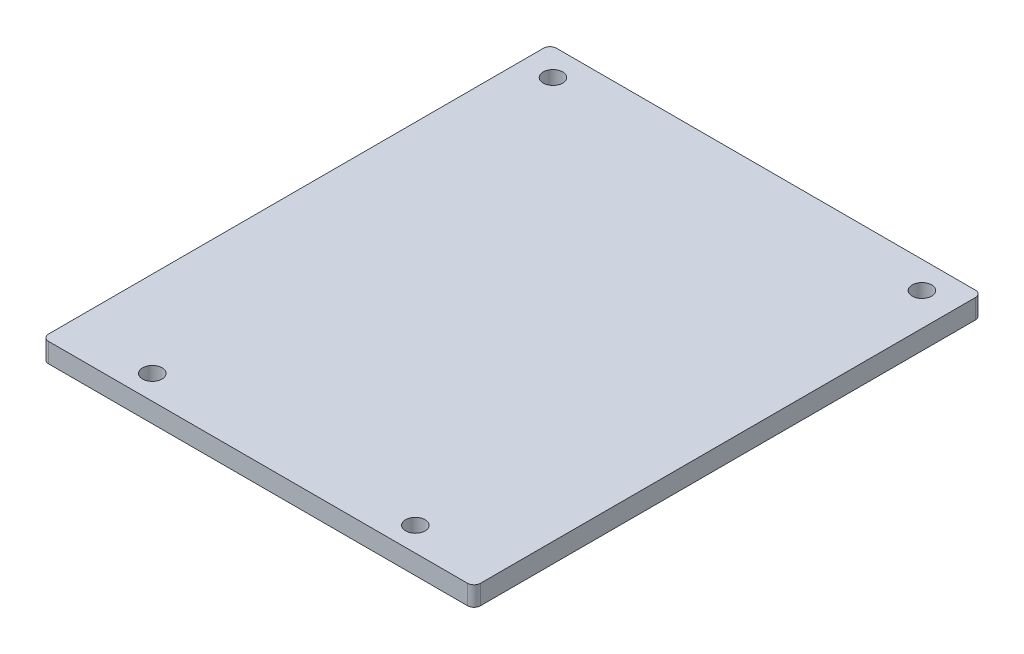
ISO-10303-21;
HEADER;
FILE_DESCRIPTION(('STEP AP214'),'2;1');
FILE_NAME('part.step','',(''),(''),'','','');
FILE_SCHEMA(('AUTOMOTIVE_DESIGN { 1 0 10303 214 1 1 1 1 }'));
ENDSEC;
DATA;
#1=APPLICATION_CONTEXT('core data for automotive mechanical design processes');
#2=APPLICATION_PROTOCOL_DEFINITION('international standard','automotive_design',2000,#1);
#3=PRODUCT_CONTEXT('',#1,'mechanical');
#4=PRODUCT('Part','Part','',(#3));
#5=PRODUCT_RELATED_PRODUCT_CATEGORY('part','',(#4));
#6=PRODUCT_DEFINITION_FORMATION('','',#4);
#7=PRODUCT_DEFINITION_CONTEXT('part definition',#1,'design');
#8=PRODUCT_DEFINITION('design','',#6,#7);
#9=PRODUCT_DEFINITION_SHAPE('','',#8);
#10=(LENGTH_UNIT() NAMED_UNIT(*) SI_UNIT(.MILLI.,.METRE.));
#11=(NAMED_UNIT(*) PLANE_ANGLE_UNIT() SI_UNIT($,.RADIAN.));
#12=(NAMED_UNIT(*) SI_UNIT($,.STERADIAN.) SOLID_ANGLE_UNIT());
#13=UNCERTAINTY_MEASURE_WITH_UNIT(LENGTH_MEASURE(1.E-05),#10,'distance_accuracy_value','');
#14=(GEOMETRIC_REPRESENTATION_CONTEXT(3) GLOBAL_UNCERTAINTY_ASSIGNED_CONTEXT((#13)) GLOBAL_UNIT_ASSIGNED_CONTEXT((#10,
#11,#12)) REPRESENTATION_CONTEXT('',''));
#15=CARTESIAN_POINT('',(0.,0.,0.));
#16=DIRECTION('',(0.,0.,1.));
#17=DIRECTION('',(1.,0.,0.));
#18=AXIS2_PLACEMENT_3D('',#15,#16,#17);
#19=CARTESIAN_POINT('',(0.,3.,0.));
#20=DIRECTION('',(1.,0.,0.));
#21=DIRECTION('',(0.,0.,-1.));
#22=AXIS2_PLACEMENT_3D('',#19,#20,#21);
#23=PLANE('',#22);
#24=DIRECTION('',(0.,0.,1.));
#25=VECTOR('',#24,1.);
#26=CARTESIAN_POINT('',(0.,0.,0.));
#27=LINE('',#26,#25);
#28=CARTESIAN_POINT('',(0.,0.,-77.105));
#29=VERTEX_POINT('',#28);
#30=CARTESIAN_POINT('',(0.,0.,-1.));
#31=VERTEX_POINT('',#30);
#32=EDGE_CURVE('E136',#29,#31,#27,.T.);
#33=ORIENTED_EDGE('',*,*,#32,.T.);
#34=DIRECTION('',(0.,-1.,0.));
#35=VECTOR('',#34,1.);
#36=CARTESIAN_POINT('',(0.,3.,-1.));
#37=LINE('',#36,#35);
#38=CARTESIAN_POINT('',(0.,3.,-1.));
#39=VERTEX_POINT('',#38);
#40=EDGE_CURVE('E111',#31,#39,#37,.F.);
#41=ORIENTED_EDGE('',*,*,#40,.T.);
#42=DIRECTION('',(0.,0.,1.));
#43=VECTOR('',#42,1.);
#44=CARTESIAN_POINT('',(0.,3.,0.));
#45=LINE('',#44,#43);
#46=CARTESIAN_POINT('',(0.,3.,-77.105));
#47=VERTEX_POINT('',#46);
#48=EDGE_CURVE('E149',#47,#39,#45,.T.);
#49=ORIENTED_EDGE('',*,*,#48,.F.);
#50=DIRECTION('',(0.,-1.,0.));
#51=VECTOR('',#50,1.);
#52=CARTESIAN_POINT('',(0.,3.,-77.105));
#53=LINE('',#52,#51);
#54=EDGE_CURVE('E117',#47,#29,#53,.T.);
#55=ORIENTED_EDGE('',*,*,#54,.T.);
#56=EDGE_LOOP('',(#33,#41,#49,#55));
#57=FACE_BOUND('',#56,.T.);
#58=ADVANCED_FACE('F39',(#57),#23,.F.);
#59=CARTESIAN_POINT('',(0.,3.,0.));
#60=DIRECTION('',(0.,0.,-1.));
#61=DIRECTION('',(-1.,0.,0.));
#62=AXIS2_PLACEMENT_3D('',#59,#60,#61);
#63=PLANE('',#62);
#64=DIRECTION('',(1.,0.,0.));
#65=VECTOR('',#64,1.);
#66=CARTESIAN_POINT('',(0.,3.,0.));
#67=LINE('',#66,#65);
#68=CARTESIAN_POINT('',(1.,3.,0.));
#69=VERTEX_POINT('',#68);
#70=CARTESIAN_POINT('',(65.421,3.,0.));
#71=VERTEX_POINT('',#70);
#72=EDGE_CURVE('E127',#69,#71,#67,.T.);
#73=ORIENTED_EDGE('',*,*,#72,.F.);
#74=DIRECTION('',(0.,-1.,0.));
#75=VECTOR('',#74,1.);
#76=CARTESIAN_POINT('',(1.,3.,0.));
#77=LINE('',#76,#75);
#78=CARTESIAN_POINT('',(1.,0.,0.));
#79=VERTEX_POINT('',#78);
#80=EDGE_CURVE('E110',#69,#79,#77,.T.);
#81=ORIENTED_EDGE('',*,*,#80,.T.);
#82=DIRECTION('',(1.,0.,0.));
#83=VECTOR('',#82,1.);
#84=CARTESIAN_POINT('',(0.,0.,0.));
#85=LINE('',#84,#83);
#86=CARTESIAN_POINT('',(65.421,0.,0.));
#87=VERTEX_POINT('',#86);
#88=EDGE_CURVE('E124',#79,#87,#85,.T.);
#89=ORIENTED_EDGE('',*,*,#88,.T.);
#90=DIRECTION('',(0.,-1.,0.));
#91=VECTOR('',#90,1.);
#92=CARTESIAN_POINT('',(65.421,3.,0.));
#93=LINE('',#92,#91);
#94=EDGE_CURVE('E130',#87,#71,#93,.F.);
#95=ORIENTED_EDGE('',*,*,#94,.T.);
#96=EDGE_LOOP('',(#73,#81,#89,#95));
#97=FACE_BOUND('',#96,.T.);
#98=ADVANCED_FACE('F123',(#97),#63,.F.);
#99=CARTESIAN_POINT('',(66.421,3.,0.));
#100=DIRECTION('',(-1.,0.,0.));
#101=DIRECTION('',(0.,0.,1.));
#102=AXIS2_PLACEMENT_3D('',#99,#100,#101);
#103=PLANE('',#102);
#104=DIRECTION('',(0.,0.,-1.));
#105=VECTOR('',#104,1.);
#106=CARTESIAN_POINT('',(66.421,3.,0.));
#107=LINE('',#106,#105);
#108=CARTESIAN_POINT('',(66.421,3.,-1.));
#109=VERTEX_POINT('',#108);
#110=CARTESIAN_POINT('',(66.421,3.,-77.105));
#111=VERTEX_POINT('',#110);
#112=EDGE_CURVE('E185',#109,#111,#107,.T.);
#113=ORIENTED_EDGE('',*,*,#112,.F.);
#114=DIRECTION('',(0.,-1.,0.));
#115=VECTOR('',#114,1.);
#116=CARTESIAN_POINT('',(66.421,3.,-1.));
#117=LINE('',#116,#115);
#118=CARTESIAN_POINT('',(66.421,0.,-1.));
#119=VERTEX_POINT('',#118);
#120=EDGE_CURVE('E179',#109,#119,#117,.T.);
#121=ORIENTED_EDGE('',*,*,#120,.T.);
#122=DIRECTION('',(0.,0.,-1.));
#123=VECTOR('',#122,1.);
#124=CARTESIAN_POINT('',(66.421,0.,0.));
#125=LINE('',#124,#123);
#126=CARTESIAN_POINT('',(66.421,0.,-77.105));
#127=VERTEX_POINT('',#126);
#128=EDGE_CURVE('E135',#119,#127,#125,.T.);
#129=ORIENTED_EDGE('',*,*,#128,.T.);
#130=DIRECTION('',(0.,-1.,0.));
#131=VECTOR('',#130,1.);
#132=CARTESIAN_POINT('',(66.421,3.,-77.105));
#133=LINE('',#132,#131);
#134=EDGE_CURVE('E176',#127,#111,#133,.F.);
#135=ORIENTED_EDGE('',*,*,#134,.T.);
#136=EDGE_LOOP('',(#113,#121,#129,#135));
#137=FACE_BOUND('',#136,.T.);
#138=ADVANCED_FACE('F266',(#137),#103,.F.);
#139=CARTESIAN_POINT('',(0.,3.,-78.105));
#140=DIRECTION('',(0.,0.,1.));
#141=DIRECTION('',(1.,0.,0.));
#142=AXIS2_PLACEMENT_3D('',#139,#140,#141);
#143=PLANE('',#142);
#144=DIRECTION('',(-1.,0.,0.));
#145=VECTOR('',#144,1.);
#146=CARTESIAN_POINT('',(0.,3.,-78.105));
#147=LINE('',#146,#145);
#148=CARTESIAN_POINT('',(65.421,3.,-78.105));
#149=VERTEX_POINT('',#148);
#150=CARTESIAN_POINT('',(0.999999999999973,3.,-78.105));
#151=VERTEX_POINT('',#150);
#152=EDGE_CURVE('E151',#149,#151,#147,.T.);
#153=ORIENTED_EDGE('',*,*,#152,.F.);
#154=DIRECTION('',(0.,-1.,0.));
#155=VECTOR('',#154,1.);
#156=CARTESIAN_POINT('',(65.421,3.,-78.105));
#157=LINE('',#156,#155);
#158=CARTESIAN_POINT('',(65.421,0.,-78.105));
#159=VERTEX_POINT('',#158);
#160=EDGE_CURVE('E11',#149,#159,#157,.T.);
#161=ORIENTED_EDGE('',*,*,#160,.T.);
#162=DIRECTION('',(-1.,0.,0.));
#163=VECTOR('',#162,1.);
#164=CARTESIAN_POINT('',(0.,0.,-78.105));
#165=LINE('',#164,#163);
#166=CARTESIAN_POINT('',(0.999999999999973,0.,-78.105));
#167=VERTEX_POINT('',#166);
#168=EDGE_CURVE('E141',#159,#167,#165,.T.);
#169=ORIENTED_EDGE('',*,*,#168,.T.);
#170=DIRECTION('',(0.,-1.,0.));
#171=VECTOR('',#170,1.);
#172=CARTESIAN_POINT('',(0.999999999999973,3.,-78.105));
#173=LINE('',#172,#171);
#174=EDGE_CURVE('E48',#167,#151,#173,.F.);
#175=ORIENTED_EDGE('',*,*,#174,.T.);
#176=EDGE_LOOP('',(#153,#161,#169,#175));
#177=FACE_BOUND('',#176,.T.);
#178=ADVANCED_FACE('F238',(#177),#143,.F.);
#179=CARTESIAN_POINT('',(0.,3.,0.));
#180=DIRECTION('',(0.,-1.,0.));
#181=DIRECTION('',(0.,0.,-1.));
#182=AXIS2_PLACEMENT_3D('',#179,#180,#181);
#183=PLANE('',#182);
#184=CARTESIAN_POINT('',(4.62799999999997,3.,-73.936));
#185=DIRECTION('',(0.,1.,0.));
#186=DIRECTION('',(0.,0.,1.));
#187=AXIS2_PLACEMENT_3D('',#184,#185,#186);
#188=CIRCLE('',#187,1.5);
#189=CARTESIAN_POINT('',(4.62799999999997,3.,-72.436));
#190=VERTEX_POINT('',#189);
#191=EDGE_CURVE('E211',#190,#190,#188,.T.);
#192=ORIENTED_EDGE('',*,*,#191,.F.);
#193=EDGE_LOOP('',(#192));
#194=FACE_BOUND('',#193,.T.);
#195=CARTESIAN_POINT('',(53.695,3.,-3.70800000000002));
#196=DIRECTION('',(0.,1.,0.));
#197=DIRECTION('',(0.,0.,1.));
#198=AXIS2_PLACEMENT_3D('',#195,#196,#197);
#199=CIRCLE('',#198,1.5);
#200=CARTESIAN_POINT('',(53.695,3.,-2.20800000000002));
#201=VERTEX_POINT('',#200);
#202=EDGE_CURVE('E199',#201,#201,#199,.T.);
#203=ORIENTED_EDGE('',*,*,#202,.F.);
#204=EDGE_LOOP('',(#203));
#205=FACE_BOUND('',#204,.T.);
#206=CARTESIAN_POINT('',(13.233,3.,-3.70800000000001));
#207=DIRECTION('',(0.,1.,0.));
#208=DIRECTION('',(0.,0.,1.));
#209=AXIS2_PLACEMENT_3D('',#206,#207,#208);
#210=CIRCLE('',#209,1.5);
#211=CARTESIAN_POINT('',(13.233,3.,-2.20800000000001));
#212=VERTEX_POINT('',#211);
#213=EDGE_CURVE('E198',#212,#212,#210,.T.);
#214=ORIENTED_EDGE('',*,*,#213,.F.);
#215=EDGE_LOOP('',(#214));
#216=FACE_BOUND('',#215,.T.);
#217=CARTESIAN_POINT('',(61.376,3.,-73.936));
#218=DIRECTION('',(0.,1.,0.));
#219=DIRECTION('',(0.,0.,1.));
#220=AXIS2_PLACEMENT_3D('',#217,#218,#219);
#221=CIRCLE('',#220,1.5);
#222=CARTESIAN_POINT('',(61.376,3.,-72.436));
#223=VERTEX_POINT('',#222);
#224=EDGE_CURVE('E207',#223,#223,#221,.T.);
#225=ORIENTED_EDGE('',*,*,#224,.F.);
#226=EDGE_LOOP('',(#225));
#227=FACE_BOUND('',#226,.T.);
#228=ORIENTED_EDGE('',*,*,#48,.T.);
#229=CARTESIAN_POINT('',(1.,3.,-1.));
#230=DIRECTION('',(0.,-1.,0.));
#231=DIRECTION('',(0.,0.,-1.));
#232=AXIS2_PLACEMENT_3D('',#229,#230,#231);
#233=CIRCLE('',#232,1.);
#234=EDGE_CURVE('E173',#39,#69,#233,.F.);
#235=ORIENTED_EDGE('',*,*,#234,.T.);
#236=ORIENTED_EDGE('',*,*,#72,.T.);
#237=CARTESIAN_POINT('',(65.421,3.,-1.));
#238=DIRECTION('',(0.,-1.,0.));
#239=DIRECTION('',(0.,0.,-1.));
#240=AXIS2_PLACEMENT_3D('',#237,#238,#239);
#241=CIRCLE('',#240,1.);
#242=EDGE_CURVE('E170',#71,#109,#241,.F.);
#243=ORIENTED_EDGE('',*,*,#242,.T.);
#244=ORIENTED_EDGE('',*,*,#112,.T.);
#245=CARTESIAN_POINT('',(65.421,3.,-77.105));
#246=DIRECTION('',(0.,-1.,0.));
#247=DIRECTION('',(0.,0.,-1.));
#248=AXIS2_PLACEMENT_3D('',#245,#246,#247);
#249=CIRCLE('',#248,1.);
#250=EDGE_CURVE('E61',#111,#149,#249,.F.);
#251=ORIENTED_EDGE('',*,*,#250,.T.);
#252=ORIENTED_EDGE('',*,*,#152,.T.);
#253=CARTESIAN_POINT('',(0.999999999999973,3.,-77.105));
#254=DIRECTION('',(0.,-1.,0.));
#255=DIRECTION('',(0.,0.,-1.));
#256=AXIS2_PLACEMENT_3D('',#253,#254,#255);
#257=CIRCLE('',#256,1.);
#258=EDGE_CURVE('E165',#151,#47,#257,.F.);
#259=ORIENTED_EDGE('',*,*,#258,.T.);
#260=EDGE_LOOP('',(#228,#235,#236,#243,#244,#251,#252,#259));
#261=FACE_BOUND('',#260,.T.);
#262=ADVANCED_FACE('F235',(#194,#205,#216,#227,#261),#183,.F.);
#263=CARTESIAN_POINT('',(0.,0.,0.));
#264=DIRECTION('',(0.,-1.,0.));
#265=DIRECTION('',(0.,0.,-1.));
#266=AXIS2_PLACEMENT_3D('',#263,#264,#265);
#267=PLANE('',#266);
#268=CARTESIAN_POINT('',(4.62799999999997,0.,-73.936));
#269=DIRECTION('',(0.,1.,0.));
#270=DIRECTION('',(0.,0.,1.));
#271=AXIS2_PLACEMENT_3D('',#268,#269,#270);
#272=CIRCLE('',#271,1.5);
#273=CARTESIAN_POINT('',(4.62799999999997,0.,-72.436));
#274=VERTEX_POINT('',#273);
#275=EDGE_CURVE('E143',#274,#274,#272,.T.);
#276=ORIENTED_EDGE('',*,*,#275,.T.);
#277=EDGE_LOOP('',(#276));
#278=FACE_BOUND('',#277,.T.);
#279=CARTESIAN_POINT('',(53.695,0.,-3.70800000000002));
#280=DIRECTION('',(0.,1.,0.));
#281=DIRECTION('',(0.,0.,1.));
#282=AXIS2_PLACEMENT_3D('',#279,#280,#281);
#283=CIRCLE('',#282,1.5);
#284=CARTESIAN_POINT('',(53.695,0.,-2.20800000000002));
#285=VERTEX_POINT('',#284);
#286=EDGE_CURVE('E212',#285,#285,#283,.T.);
#287=ORIENTED_EDGE('',*,*,#286,.T.);
#288=EDGE_LOOP('',(#287));
#289=FACE_BOUND('',#288,.T.);
#290=CARTESIAN_POINT('',(13.233,0.,-3.70800000000001));
#291=DIRECTION('',(0.,1.,0.));
#292=DIRECTION('',(0.,0.,1.));
#293=AXIS2_PLACEMENT_3D('',#290,#291,#292);
#294=CIRCLE('',#293,1.5);
#295=CARTESIAN_POINT('',(13.233,0.,-2.20800000000001));
#296=VERTEX_POINT('',#295);
#297=EDGE_CURVE('E194',#296,#296,#294,.T.);
#298=ORIENTED_EDGE('',*,*,#297,.T.);
#299=EDGE_LOOP('',(#298));
#300=FACE_BOUND('',#299,.T.);
#301=CARTESIAN_POINT('',(61.376,0.,-73.936));
#302=DIRECTION('',(0.,1.,0.));
#303=DIRECTION('',(0.,0.,1.));
#304=AXIS2_PLACEMENT_3D('',#301,#302,#303);
#305=CIRCLE('',#304,1.5);
#306=CARTESIAN_POINT('',(61.376,0.,-72.436));
#307=VERTEX_POINT('',#306);
#308=EDGE_CURVE('E203',#307,#307,#305,.T.);
#309=ORIENTED_EDGE('',*,*,#308,.T.);
#310=EDGE_LOOP('',(#309));
#311=FACE_BOUND('',#310,.T.);
#312=ORIENTED_EDGE('',*,*,#88,.F.);
#313=CARTESIAN_POINT('',(1.,0.,-1.));
#314=DIRECTION('',(0.,-1.,0.));
#315=DIRECTION('',(0.,0.,-1.));
#316=AXIS2_PLACEMENT_3D('',#313,#314,#315);
#317=CIRCLE('',#316,1.);
#318=EDGE_CURVE('E106',#79,#31,#317,.T.);
#319=ORIENTED_EDGE('',*,*,#318,.T.);
#320=ORIENTED_EDGE('',*,*,#32,.F.);
#321=CARTESIAN_POINT('',(0.999999999999973,0.,-77.105));
#322=DIRECTION('',(0.,-1.,0.));
#323=DIRECTION('',(0.,0.,-1.));
#324=AXIS2_PLACEMENT_3D('',#321,#322,#323);
#325=CIRCLE('',#324,1.);
#326=EDGE_CURVE('E129',#29,#167,#325,.T.);
#327=ORIENTED_EDGE('',*,*,#326,.T.);
#328=ORIENTED_EDGE('',*,*,#168,.F.);
#329=CARTESIAN_POINT('',(65.421,0.,-77.105));
#330=DIRECTION('',(0.,-1.,0.));
#331=DIRECTION('',(0.,0.,-1.));
#332=AXIS2_PLACEMENT_3D('',#329,#330,#331);
#333=CIRCLE('',#332,1.);
#334=EDGE_CURVE('E155',#159,#127,#333,.T.);
#335=ORIENTED_EDGE('',*,*,#334,.T.);
#336=ORIENTED_EDGE('',*,*,#128,.F.);
#337=CARTESIAN_POINT('',(65.421,0.,-1.));
#338=DIRECTION('',(0.,-1.,0.));
#339=DIRECTION('',(0.,0.,-1.));
#340=AXIS2_PLACEMENT_3D('',#337,#338,#339);
#341=CIRCLE('',#340,1.);
#342=EDGE_CURVE('E118',#119,#87,#341,.T.);
#343=ORIENTED_EDGE('',*,*,#342,.T.);
#344=EDGE_LOOP('',(#312,#319,#320,#327,#328,#335,#336,#343));
#345=FACE_BOUND('',#344,.T.);
#346=ADVANCED_FACE('F132',(#278,#289,#300,#311,#345),#267,.T.);
#347=CARTESIAN_POINT('',(61.376,0.,-73.936));
#348=DIRECTION('',(0.,1.,0.));
#349=DIRECTION('',(0.,0.,1.));
#350=AXIS2_PLACEMENT_3D('',#347,#348,#349);
#351=CYLINDRICAL_SURFACE('',#350,1.5);
#352=ORIENTED_EDGE('',*,*,#308,.F.);
#353=EDGE_LOOP('',(#352));
#354=FACE_BOUND('',#353,.T.);
#355=ORIENTED_EDGE('',*,*,#224,.T.);
#356=EDGE_LOOP('',(#355));
#357=FACE_BOUND('',#356,.T.);
#358=ADVANCED_FACE('F246',(#354,#357),#351,.F.);
#359=CARTESIAN_POINT('',(13.233,0.,-3.70800000000001));
#360=DIRECTION('',(0.,1.,0.));
#361=DIRECTION('',(0.,0.,1.));
#362=AXIS2_PLACEMENT_3D('',#359,#360,#361);
#363=CYLINDRICAL_SURFACE('',#362,1.5);
#364=ORIENTED_EDGE('',*,*,#297,.F.);
#365=EDGE_LOOP('',(#364));
#366=FACE_BOUND('',#365,.T.);
#367=ORIENTED_EDGE('',*,*,#213,.T.);
#368=EDGE_LOOP('',(#367));
#369=FACE_BOUND('',#368,.T.);
#370=ADVANCED_FACE('F248',(#366,#369),#363,.F.);
#371=CARTESIAN_POINT('',(53.695,0.,-3.70800000000002));
#372=DIRECTION('',(0.,1.,0.));
#373=DIRECTION('',(0.,0.,1.));
#374=AXIS2_PLACEMENT_3D('',#371,#372,#373);
#375=CYLINDRICAL_SURFACE('',#374,1.5);
#376=ORIENTED_EDGE('',*,*,#286,.F.);
#377=EDGE_LOOP('',(#376));
#378=FACE_BOUND('',#377,.T.);
#379=ORIENTED_EDGE('',*,*,#202,.T.);
#380=EDGE_LOOP('',(#379));
#381=FACE_BOUND('',#380,.T.);
#382=ADVANCED_FACE('F231',(#378,#381),#375,.F.);
#383=CARTESIAN_POINT('',(4.62799999999997,0.,-73.936));
#384=DIRECTION('',(0.,1.,0.));
#385=DIRECTION('',(0.,0.,1.));
#386=AXIS2_PLACEMENT_3D('',#383,#384,#385);
#387=CYLINDRICAL_SURFACE('',#386,1.5);
#388=ORIENTED_EDGE('',*,*,#275,.F.);
#389=EDGE_LOOP('',(#388));
#390=FACE_BOUND('',#389,.T.);
#391=ORIENTED_EDGE('',*,*,#191,.T.);
#392=EDGE_LOOP('',(#391));
#393=FACE_BOUND('',#392,.T.);
#394=ADVANCED_FACE('F228',(#390,#393),#387,.F.);
#395=CARTESIAN_POINT('',(1.,3.,-1.));
#396=DIRECTION('',(0.,-1.,0.));
#397=DIRECTION('',(0.,0.,-1.));
#398=AXIS2_PLACEMENT_3D('',#395,#396,#397);
#399=CYLINDRICAL_SURFACE('',#398,1.);
#400=ORIENTED_EDGE('',*,*,#234,.F.);
#401=ORIENTED_EDGE('',*,*,#40,.F.);
#402=ORIENTED_EDGE('',*,*,#318,.F.);
#403=ORIENTED_EDGE('',*,*,#80,.F.);
#404=EDGE_LOOP('',(#400,#401,#402,#403));
#405=FACE_BOUND('',#404,.T.);
#406=ADVANCED_FACE('F109',(#405),#399,.T.);
#407=CARTESIAN_POINT('',(65.421,3.,-1.));
#408=DIRECTION('',(0.,-1.,0.));
#409=DIRECTION('',(0.,0.,-1.));
#410=AXIS2_PLACEMENT_3D('',#407,#408,#409);
#411=CYLINDRICAL_SURFACE('',#410,1.);
#412=ORIENTED_EDGE('',*,*,#242,.F.);
#413=ORIENTED_EDGE('',*,*,#94,.F.);
#414=ORIENTED_EDGE('',*,*,#342,.F.);
#415=ORIENTED_EDGE('',*,*,#120,.F.);
#416=EDGE_LOOP('',(#412,#413,#414,#415));
#417=FACE_BOUND('',#416,.T.);
#418=ADVANCED_FACE('F272',(#417),#411,.T.);
#419=CARTESIAN_POINT('',(65.421,3.,-77.105));
#420=DIRECTION('',(0.,-1.,0.));
#421=DIRECTION('',(0.,0.,-1.));
#422=AXIS2_PLACEMENT_3D('',#419,#420,#421);
#423=CYLINDRICAL_SURFACE('',#422,1.);
#424=ORIENTED_EDGE('',*,*,#250,.F.);
#425=ORIENTED_EDGE('',*,*,#134,.F.);
#426=ORIENTED_EDGE('',*,*,#334,.F.);
#427=ORIENTED_EDGE('',*,*,#160,.F.);
#428=EDGE_LOOP('',(#424,#425,#426,#427));
#429=FACE_BOUND('',#428,.T.);
#430=ADVANCED_FACE('F274',(#429),#423,.T.);
#431=CARTESIAN_POINT('',(0.999999999999973,3.,-77.105));
#432=DIRECTION('',(0.,-1.,0.));
#433=DIRECTION('',(0.,0.,-1.));
#434=AXIS2_PLACEMENT_3D('',#431,#432,#433);
#435=CYLINDRICAL_SURFACE('',#434,1.);
#436=ORIENTED_EDGE('',*,*,#258,.F.);
#437=ORIENTED_EDGE('',*,*,#174,.F.);
#438=ORIENTED_EDGE('',*,*,#326,.F.);
#439=ORIENTED_EDGE('',*,*,#54,.F.);
#440=EDGE_LOOP('',(#436,#437,#438,#439));
#441=FACE_BOUND('',#440,.T.);
#442=ADVANCED_FACE('F41',(#441),#435,.T.);
#443=CLOSED_SHELL('',(#58,#98,#138,#178,#262,#346,#358,#370,#382,#394,#406,#418,#430,#442));
#444=MANIFOLD_SOLID_BREP('B2',#443);
#445=ADVANCED_BREP_SHAPE_REPRESENTATION('',(#18,#444),#14);
#446=SHAPE_DEFINITION_REPRESENTATION(#9,#445);
ENDSEC;
END-ISO-10303-21;
